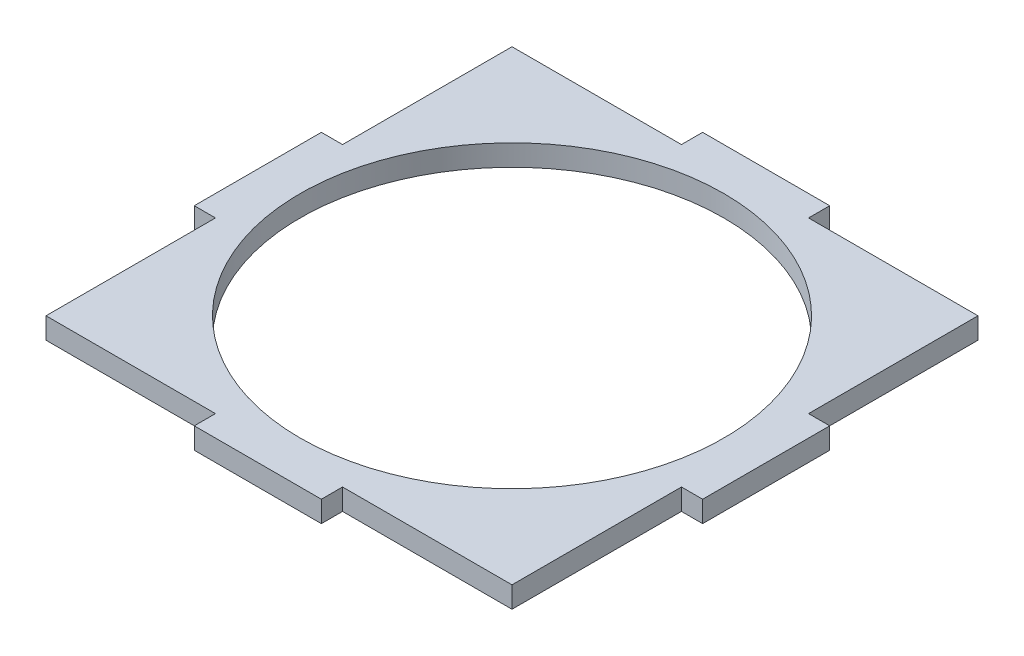
ISO-10303-21;
HEADER;
FILE_DESCRIPTION(('STEP AP214'),'2;1');
FILE_NAME('part.step','',(''),(''),'','','');
FILE_SCHEMA(('AUTOMOTIVE_DESIGN { 1 0 10303 214 1 1 1 1 }'));
ENDSEC;
DATA;
#1=APPLICATION_CONTEXT('core data for automotive mechanical design processes');
#2=APPLICATION_PROTOCOL_DEFINITION('international standard','automotive_design',2000,#1);
#3=PRODUCT_CONTEXT('',#1,'mechanical');
#4=PRODUCT('Part','Part','',(#3));
#5=PRODUCT_RELATED_PRODUCT_CATEGORY('part','',(#4));
#6=PRODUCT_DEFINITION_FORMATION('','',#4);
#7=PRODUCT_DEFINITION_CONTEXT('part definition',#1,'design');
#8=PRODUCT_DEFINITION('design','',#6,#7);
#9=PRODUCT_DEFINITION_SHAPE('','',#8);
#10=(LENGTH_UNIT() NAMED_UNIT(*) SI_UNIT(.MILLI.,.METRE.));
#11=(NAMED_UNIT(*) PLANE_ANGLE_UNIT() SI_UNIT($,.RADIAN.));
#12=(NAMED_UNIT(*) SI_UNIT($,.STERADIAN.) SOLID_ANGLE_UNIT());
#13=UNCERTAINTY_MEASURE_WITH_UNIT(LENGTH_MEASURE(1.E-05),#10,'distance_accuracy_value','');
#14=(GEOMETRIC_REPRESENTATION_CONTEXT(3) GLOBAL_UNCERTAINTY_ASSIGNED_CONTEXT((#13)) GLOBAL_UNIT_ASSIGNED_CONTEXT((#10,
#11,#12)) REPRESENTATION_CONTEXT('',''));
#15=CARTESIAN_POINT('',(0.,0.,0.));
#16=DIRECTION('',(0.,0.,1.));
#17=DIRECTION('',(1.,0.,0.));
#18=AXIS2_PLACEMENT_3D('',#15,#16,#17);
#19=CARTESIAN_POINT('',(-69.85,6.35,-69.85));
#20=DIRECTION('',(0.,0.,-1.));
#21=DIRECTION('',(-1.,0.,0.));
#22=AXIS2_PLACEMENT_3D('',#19,#20,#21);
#23=PLANE('',#22);
#24=DIRECTION('',(1.,0.,0.));
#25=VECTOR('',#24,1.);
#26=CARTESIAN_POINT('',(-69.85,6.35,-69.85));
#27=LINE('',#26,#25);
#28=CARTESIAN_POINT('',(-69.85,6.35,-69.85));
#29=VERTEX_POINT('',#28);
#30=CARTESIAN_POINT('',(-19.0500000000001,6.35,-69.85));
#31=VERTEX_POINT('',#30);
#32=EDGE_CURVE('E204',#29,#31,#27,.T.);
#33=ORIENTED_EDGE('',*,*,#32,.T.);
#34=DIRECTION('',(0.,-1.,0.));
#35=VECTOR('',#34,1.);
#36=CARTESIAN_POINT('',(-19.0500000000001,6.35,-69.85));
#37=LINE('',#36,#35);
#38=CARTESIAN_POINT('',(-19.0500000000001,0.,-69.85));
#39=VERTEX_POINT('',#38);
#40=EDGE_CURVE('E187',#31,#39,#37,.T.);
#41=ORIENTED_EDGE('',*,*,#40,.T.);
#42=DIRECTION('',(1.,0.,0.));
#43=VECTOR('',#42,1.);
#44=CARTESIAN_POINT('',(-69.85,0.,-69.85));
#45=LINE('',#44,#43);
#46=CARTESIAN_POINT('',(-69.85,0.,-69.85));
#47=VERTEX_POINT('',#46);
#48=EDGE_CURVE('E247',#47,#39,#45,.T.);
#49=ORIENTED_EDGE('',*,*,#48,.F.);
#50=DIRECTION('',(0.,-1.,0.));
#51=VECTOR('',#50,1.);
#52=CARTESIAN_POINT('',(-69.85,6.35,-69.85));
#53=LINE('',#52,#51);
#54=EDGE_CURVE('E213',#29,#47,#53,.T.);
#55=ORIENTED_EDGE('',*,*,#54,.F.);
#56=EDGE_LOOP('',(#33,#41,#49,#55));
#57=FACE_BOUND('',#56,.T.);
#58=ADVANCED_FACE('F50',(#57),#23,.T.);
#59=CARTESIAN_POINT('',(69.85,6.35,69.85));
#60=DIRECTION('',(-1.,0.,0.));
#61=DIRECTION('',(0.,0.,1.));
#62=AXIS2_PLACEMENT_3D('',#59,#60,#61);
#63=PLANE('',#62);
#64=DIRECTION('',(0.,-1.,0.));
#65=VECTOR('',#64,1.);
#66=CARTESIAN_POINT('',(69.85,6.35,19.0500000000001));
#67=LINE('',#66,#65);
#68=CARTESIAN_POINT('',(69.85,6.35,19.0500000000001));
#69=VERTEX_POINT('',#68);
#70=CARTESIAN_POINT('',(69.85,0.,19.0500000000001));
#71=VERTEX_POINT('',#70);
#72=EDGE_CURVE('E294',#69,#71,#67,.T.);
#73=ORIENTED_EDGE('',*,*,#72,.F.);
#74=DIRECTION('',(0.,0.,-1.));
#75=VECTOR('',#74,1.);
#76=CARTESIAN_POINT('',(69.85,6.35,69.85));
#77=LINE('',#76,#75);
#78=CARTESIAN_POINT('',(69.85,6.35,69.85));
#79=VERTEX_POINT('',#78);
#80=EDGE_CURVE('E219',#79,#69,#77,.T.);
#81=ORIENTED_EDGE('',*,*,#80,.F.);
#82=DIRECTION('',(0.,-1.,0.));
#83=VECTOR('',#82,1.);
#84=CARTESIAN_POINT('',(69.85,6.35,69.85));
#85=LINE('',#84,#83);
#86=CARTESIAN_POINT('',(69.85,0.,69.85));
#87=VERTEX_POINT('',#86);
#88=EDGE_CURVE('E12',#79,#87,#85,.T.);
#89=ORIENTED_EDGE('',*,*,#88,.T.);
#90=DIRECTION('',(0.,0.,-1.));
#91=VECTOR('',#90,1.);
#92=CARTESIAN_POINT('',(69.85,0.,69.85));
#93=LINE('',#92,#91);
#94=EDGE_CURVE('E271',#87,#71,#93,.T.);
#95=ORIENTED_EDGE('',*,*,#94,.T.);
#96=EDGE_LOOP('',(#73,#81,#89,#95));
#97=FACE_BOUND('',#96,.T.);
#98=ADVANCED_FACE('F407',(#97),#63,.F.);
#99=CARTESIAN_POINT('',(-69.85,6.35,69.85));
#100=DIRECTION('',(0.,0.,-1.));
#101=DIRECTION('',(-1.,0.,0.));
#102=AXIS2_PLACEMENT_3D('',#99,#100,#101);
#103=PLANE('',#102);
#104=DIRECTION('',(0.,-1.,0.));
#105=VECTOR('',#104,1.);
#106=CARTESIAN_POINT('',(-19.05,6.35,69.85));
#107=LINE('',#106,#105);
#108=CARTESIAN_POINT('',(-19.05,6.35,69.85));
#109=VERTEX_POINT('',#108);
#110=CARTESIAN_POINT('',(-19.05,0.,69.85));
#111=VERTEX_POINT('',#110);
#112=EDGE_CURVE('E317',#109,#111,#107,.T.);
#113=ORIENTED_EDGE('',*,*,#112,.F.);
#114=DIRECTION('',(1.,0.,0.));
#115=VECTOR('',#114,1.);
#116=CARTESIAN_POINT('',(-69.85,6.35,69.85));
#117=LINE('',#116,#115);
#118=CARTESIAN_POINT('',(-69.85,6.35,69.85));
#119=VERTEX_POINT('',#118);
#120=EDGE_CURVE('E286',#119,#109,#117,.T.);
#121=ORIENTED_EDGE('',*,*,#120,.F.);
#122=DIRECTION('',(0.,-1.,0.));
#123=VECTOR('',#122,1.);
#124=CARTESIAN_POINT('',(-69.85,6.35,69.85));
#125=LINE('',#124,#123);
#126=CARTESIAN_POINT('',(-69.85,0.,69.85));
#127=VERTEX_POINT('',#126);
#128=EDGE_CURVE('E242',#119,#127,#125,.T.);
#129=ORIENTED_EDGE('',*,*,#128,.T.);
#130=DIRECTION('',(1.,0.,0.));
#131=VECTOR('',#130,1.);
#132=CARTESIAN_POINT('',(-69.85,0.,69.85));
#133=LINE('',#132,#131);
#134=EDGE_CURVE('E272',#127,#111,#133,.T.);
#135=ORIENTED_EDGE('',*,*,#134,.T.);
#136=EDGE_LOOP('',(#113,#121,#129,#135));
#137=FACE_BOUND('',#136,.T.);
#138=ADVANCED_FACE('F343',(#137),#103,.F.);
#139=CARTESIAN_POINT('',(-69.85,6.35,69.85));
#140=DIRECTION('',(-1.,0.,0.));
#141=DIRECTION('',(0.,0.,1.));
#142=AXIS2_PLACEMENT_3D('',#139,#140,#141);
#143=PLANE('',#142);
#144=DIRECTION('',(0.,0.,-1.));
#145=VECTOR('',#144,1.);
#146=CARTESIAN_POINT('',(-69.85,6.35,69.85));
#147=LINE('',#146,#145);
#148=CARTESIAN_POINT('',(-69.85,6.35,19.05));
#149=VERTEX_POINT('',#148);
#150=EDGE_CURVE('E217',#119,#149,#147,.T.);
#151=ORIENTED_EDGE('',*,*,#150,.T.);
#152=DIRECTION('',(0.,-1.,0.));
#153=VECTOR('',#152,1.);
#154=CARTESIAN_POINT('',(-69.85,6.35,19.05));
#155=LINE('',#154,#153);
#156=CARTESIAN_POINT('',(-69.85,0.,19.05));
#157=VERTEX_POINT('',#156);
#158=EDGE_CURVE('E349',#149,#157,#155,.T.);
#159=ORIENTED_EDGE('',*,*,#158,.T.);
#160=DIRECTION('',(0.,0.,-1.));
#161=VECTOR('',#160,1.);
#162=CARTESIAN_POINT('',(-69.85,0.,69.85));
#163=LINE('',#162,#161);
#164=EDGE_CURVE('E246',#127,#157,#163,.T.);
#165=ORIENTED_EDGE('',*,*,#164,.F.);
#166=ORIENTED_EDGE('',*,*,#128,.F.);
#167=EDGE_LOOP('',(#151,#159,#165,#166));
#168=FACE_BOUND('',#167,.T.);
#169=ADVANCED_FACE('F347',(#168),#143,.T.);
#170=CARTESIAN_POINT('',(0.,6.35,0.));
#171=DIRECTION('',(0.,1.,0.));
#172=DIRECTION('',(0.,0.,1.));
#173=AXIS2_PLACEMENT_3D('',#170,#171,#172);
#174=PLANE('',#173);
#175=ORIENTED_EDGE('',*,*,#120,.T.);
#176=DIRECTION('',(0.,0.,1.));
#177=VECTOR('',#176,1.);
#178=CARTESIAN_POINT('',(-19.0500000000001,6.35,0.));
#179=LINE('',#178,#177);
#180=CARTESIAN_POINT('',(-19.05,6.35,76.2));
#181=VERTEX_POINT('',#180);
#182=EDGE_CURVE('E307',#109,#181,#179,.T.);
#183=ORIENTED_EDGE('',*,*,#182,.T.);
#184=DIRECTION('',(1.,0.,0.));
#185=VECTOR('',#184,1.);
#186=CARTESIAN_POINT('',(0.,6.35,76.2));
#187=LINE('',#186,#185);
#188=CARTESIAN_POINT('',(19.05,6.35,76.2));
#189=VERTEX_POINT('',#188);
#190=EDGE_CURVE('E304',#181,#189,#187,.T.);
#191=ORIENTED_EDGE('',*,*,#190,.T.);
#192=DIRECTION('',(0.,0.,1.));
#193=VECTOR('',#192,1.);
#194=CARTESIAN_POINT('',(19.05,6.35,0.));
#195=LINE('',#194,#193);
#196=CARTESIAN_POINT('',(19.05,6.35,69.85));
#197=VERTEX_POINT('',#196);
#198=EDGE_CURVE('E306',#197,#189,#195,.T.);
#199=ORIENTED_EDGE('',*,*,#198,.F.);
#200=EDGE_CURVE('E351',#197,#79,#117,.T.);
#201=ORIENTED_EDGE('',*,*,#200,.T.);
#202=ORIENTED_EDGE('',*,*,#80,.T.);
#203=DIRECTION('',(1.,0.,0.));
#204=VECTOR('',#203,1.);
#205=CARTESIAN_POINT('',(0.,6.35,19.05));
#206=LINE('',#205,#204);
#207=CARTESIAN_POINT('',(76.2,6.35,19.0500000000001));
#208=VERTEX_POINT('',#207);
#209=EDGE_CURVE('E409',#69,#208,#206,.T.);
#210=ORIENTED_EDGE('',*,*,#209,.T.);
#211=DIRECTION('',(0.,0.,1.));
#212=VECTOR('',#211,1.);
#213=CARTESIAN_POINT('',(76.2,6.35,0.));
#214=LINE('',#213,#212);
#215=CARTESIAN_POINT('',(76.2,6.35,-19.0499999999999));
#216=VERTEX_POINT('',#215);
#217=EDGE_CURVE('E413',#216,#208,#214,.T.);
#218=ORIENTED_EDGE('',*,*,#217,.F.);
#219=DIRECTION('',(1.,0.,0.));
#220=VECTOR('',#219,1.);
#221=CARTESIAN_POINT('',(0.,6.35,-19.0499999999999));
#222=LINE('',#221,#220);
#223=CARTESIAN_POINT('',(69.85,6.35,-19.0499999999999));
#224=VERTEX_POINT('',#223);
#225=EDGE_CURVE('E295',#224,#216,#222,.T.);
#226=ORIENTED_EDGE('',*,*,#225,.F.);
#227=CARTESIAN_POINT('',(69.85,6.35,-69.85));
#228=VERTEX_POINT('',#227);
#229=EDGE_CURVE('E266',#224,#228,#77,.T.);
#230=ORIENTED_EDGE('',*,*,#229,.T.);
#231=CARTESIAN_POINT('',(19.05,6.35,-69.85));
#232=VERTEX_POINT('',#231);
#233=EDGE_CURVE('E215',#232,#228,#27,.T.);
#234=ORIENTED_EDGE('',*,*,#233,.F.);
#235=DIRECTION('',(0.,0.,-1.));
#236=VECTOR('',#235,1.);
#237=CARTESIAN_POINT('',(19.05,6.35,0.));
#238=LINE('',#237,#236);
#239=CARTESIAN_POINT('',(19.05,6.35,-76.2));
#240=VERTEX_POINT('',#239);
#241=EDGE_CURVE('E208',#232,#240,#238,.T.);
#242=ORIENTED_EDGE('',*,*,#241,.T.);
#243=DIRECTION('',(-1.,0.,0.));
#244=VECTOR('',#243,1.);
#245=CARTESIAN_POINT('',(0.,6.35,-76.2));
#246=LINE('',#245,#244);
#247=CARTESIAN_POINT('',(-19.0500000000001,6.35,-76.2));
#248=VERTEX_POINT('',#247);
#249=EDGE_CURVE('E206',#240,#248,#246,.T.);
#250=ORIENTED_EDGE('',*,*,#249,.T.);
#251=DIRECTION('',(0.,0.,-1.));
#252=VECTOR('',#251,1.);
#253=CARTESIAN_POINT('',(-19.0500000000001,6.35,0.));
#254=LINE('',#253,#252);
#255=EDGE_CURVE('E190',#31,#248,#254,.T.);
#256=ORIENTED_EDGE('',*,*,#255,.F.);
#257=ORIENTED_EDGE('',*,*,#32,.F.);
#258=CARTESIAN_POINT('',(-69.85,6.35,-19.05));
#259=VERTEX_POINT('',#258);
#260=EDGE_CURVE('E214',#259,#29,#147,.T.);
#261=ORIENTED_EDGE('',*,*,#260,.F.);
#262=DIRECTION('',(-1.,0.,0.));
#263=VECTOR('',#262,1.);
#264=CARTESIAN_POINT('',(0.,6.35,-19.05));
#265=LINE('',#264,#263);
#266=CARTESIAN_POINT('',(-76.2,6.35,-19.05));
#267=VERTEX_POINT('',#266);
#268=EDGE_CURVE('E383',#259,#267,#265,.T.);
#269=ORIENTED_EDGE('',*,*,#268,.T.);
#270=DIRECTION('',(0.,0.,-1.));
#271=VECTOR('',#270,1.);
#272=CARTESIAN_POINT('',(-76.2,6.35,0.));
#273=LINE('',#272,#271);
#274=CARTESIAN_POINT('',(-76.2,6.35,19.05));
#275=VERTEX_POINT('',#274);
#276=EDGE_CURVE('E384',#275,#267,#273,.T.);
#277=ORIENTED_EDGE('',*,*,#276,.F.);
#278=DIRECTION('',(-1.,0.,0.));
#279=VECTOR('',#278,1.);
#280=CARTESIAN_POINT('',(0.,6.35,19.05));
#281=LINE('',#280,#279);
#282=EDGE_CURVE('E380',#149,#275,#281,.T.);
#283=ORIENTED_EDGE('',*,*,#282,.F.);
#284=ORIENTED_EDGE('',*,*,#150,.F.);
#285=EDGE_LOOP('',(#175,#183,#191,#199,#201,#202,#210,#218,#226,#230,#234,#242,#250,#256,#257,
#261,#269,#277,#283,#284));
#286=FACE_BOUND('',#285,.T.);
#287=CARTESIAN_POINT('',(0.,6.35,0.));
#288=DIRECTION('',(0.,1.,0.));
#289=DIRECTION('',(0.,0.,1.));
#290=AXIS2_PLACEMENT_3D('',#287,#288,#289);
#291=CIRCLE('',#290,63.5);
#292=CARTESIAN_POINT('',(0.,6.35,63.5));
#293=VERTEX_POINT('',#292);
#294=EDGE_CURVE('E366',#293,#293,#291,.T.);
#295=ORIENTED_EDGE('',*,*,#294,.F.);
#296=EDGE_LOOP('',(#295));
#297=FACE_BOUND('',#296,.T.);
#298=ADVANCED_FACE('F201',(#286,#297),#174,.T.);
#299=CARTESIAN_POINT('',(0.,0.,0.));
#300=DIRECTION('',(0.,1.,0.));
#301=DIRECTION('',(0.,0.,1.));
#302=AXIS2_PLACEMENT_3D('',#299,#300,#301);
#303=PLANE('',#302);
#304=ORIENTED_EDGE('',*,*,#134,.F.);
#305=ORIENTED_EDGE('',*,*,#164,.T.);
#306=DIRECTION('',(-1.,0.,0.));
#307=VECTOR('',#306,1.);
#308=CARTESIAN_POINT('',(0.,0.,19.05));
#309=LINE('',#308,#307);
#310=CARTESIAN_POINT('',(-76.2,0.,19.05));
#311=VERTEX_POINT('',#310);
#312=EDGE_CURVE('E395',#157,#311,#309,.T.);
#313=ORIENTED_EDGE('',*,*,#312,.T.);
#314=DIRECTION('',(0.,0.,-1.));
#315=VECTOR('',#314,1.);
#316=CARTESIAN_POINT('',(-76.2,0.,0.));
#317=LINE('',#316,#315);
#318=CARTESIAN_POINT('',(-76.2,0.,-19.05));
#319=VERTEX_POINT('',#318);
#320=EDGE_CURVE('E471',#311,#319,#317,.T.);
#321=ORIENTED_EDGE('',*,*,#320,.T.);
#322=DIRECTION('',(-1.,0.,0.));
#323=VECTOR('',#322,1.);
#324=CARTESIAN_POINT('',(0.,0.,-19.05));
#325=LINE('',#324,#323);
#326=CARTESIAN_POINT('',(-69.85,0.,-19.05));
#327=VERTEX_POINT('',#326);
#328=EDGE_CURVE('E392',#327,#319,#325,.T.);
#329=ORIENTED_EDGE('',*,*,#328,.F.);
#330=EDGE_CURVE('E243',#327,#47,#163,.T.);
#331=ORIENTED_EDGE('',*,*,#330,.T.);
#332=ORIENTED_EDGE('',*,*,#48,.T.);
#333=DIRECTION('',(0.,0.,-1.));
#334=VECTOR('',#333,1.);
#335=CARTESIAN_POINT('',(-19.0500000000001,0.,0.));
#336=LINE('',#335,#334);
#337=CARTESIAN_POINT('',(-19.0500000000001,0.,-76.2));
#338=VERTEX_POINT('',#337);
#339=EDGE_CURVE('E67',#39,#338,#336,.T.);
#340=ORIENTED_EDGE('',*,*,#339,.T.);
#341=DIRECTION('',(-1.,0.,0.));
#342=VECTOR('',#341,1.);
#343=CARTESIAN_POINT('',(0.,0.,-76.2));
#344=LINE('',#343,#342);
#345=CARTESIAN_POINT('',(19.05,0.,-76.2));
#346=VERTEX_POINT('',#345);
#347=EDGE_CURVE('E209',#346,#338,#344,.T.);
#348=ORIENTED_EDGE('',*,*,#347,.F.);
#349=DIRECTION('',(0.,0.,-1.));
#350=VECTOR('',#349,1.);
#351=CARTESIAN_POINT('',(19.05,0.,0.));
#352=LINE('',#351,#350);
#353=CARTESIAN_POINT('',(19.05,0.,-69.85));
#354=VERTEX_POINT('',#353);
#355=EDGE_CURVE('E439',#354,#346,#352,.T.);
#356=ORIENTED_EDGE('',*,*,#355,.F.);
#357=CARTESIAN_POINT('',(69.85,0.,-69.85));
#358=VERTEX_POINT('',#357);
#359=EDGE_CURVE('E223',#354,#358,#45,.T.);
#360=ORIENTED_EDGE('',*,*,#359,.T.);
#361=CARTESIAN_POINT('',(69.85,0.,-19.0499999999999));
#362=VERTEX_POINT('',#361);
#363=EDGE_CURVE('E268',#362,#358,#93,.T.);
#364=ORIENTED_EDGE('',*,*,#363,.F.);
#365=DIRECTION('',(1.,0.,0.));
#366=VECTOR('',#365,1.);
#367=CARTESIAN_POINT('',(0.,0.,-19.0499999999999));
#368=LINE('',#367,#366);
#369=CARTESIAN_POINT('',(76.2,0.,-19.0499999999999));
#370=VERTEX_POINT('',#369);
#371=EDGE_CURVE('E75',#362,#370,#368,.T.);
#372=ORIENTED_EDGE('',*,*,#371,.T.);
#373=DIRECTION('',(0.,0.,1.));
#374=VECTOR('',#373,1.);
#375=CARTESIAN_POINT('',(76.2,0.,0.));
#376=LINE('',#375,#374);
#377=CARTESIAN_POINT('',(76.2,0.,19.0500000000001));
#378=VERTEX_POINT('',#377);
#379=EDGE_CURVE('E195',#370,#378,#376,.T.);
#380=ORIENTED_EDGE('',*,*,#379,.T.);
#381=DIRECTION('',(1.,0.,0.));
#382=VECTOR('',#381,1.);
#383=CARTESIAN_POINT('',(0.,0.,19.05));
#384=LINE('',#383,#382);
#385=EDGE_CURVE('E288',#71,#378,#384,.T.);
#386=ORIENTED_EDGE('',*,*,#385,.F.);
#387=ORIENTED_EDGE('',*,*,#94,.F.);
#388=CARTESIAN_POINT('',(19.05,0.,69.85));
#389=VERTEX_POINT('',#388);
#390=EDGE_CURVE('E277',#389,#87,#133,.T.);
#391=ORIENTED_EDGE('',*,*,#390,.F.);
#392=DIRECTION('',(0.,0.,1.));
#393=VECTOR('',#392,1.);
#394=CARTESIAN_POINT('',(19.05,0.,0.));
#395=LINE('',#394,#393);
#396=CARTESIAN_POINT('',(19.05,0.,76.2));
#397=VERTEX_POINT('',#396);
#398=EDGE_CURVE('E311',#389,#397,#395,.T.);
#399=ORIENTED_EDGE('',*,*,#398,.T.);
#400=DIRECTION('',(1.,0.,0.));
#401=VECTOR('',#400,1.);
#402=CARTESIAN_POINT('',(0.,0.,76.2));
#403=LINE('',#402,#401);
#404=CARTESIAN_POINT('',(-19.05,0.,76.2));
#405=VERTEX_POINT('',#404);
#406=EDGE_CURVE('E308',#405,#397,#403,.T.);
#407=ORIENTED_EDGE('',*,*,#406,.F.);
#408=DIRECTION('',(0.,0.,1.));
#409=VECTOR('',#408,1.);
#410=CARTESIAN_POINT('',(-19.0500000000001,0.,0.));
#411=LINE('',#410,#409);
#412=EDGE_CURVE('E303',#111,#405,#411,.T.);
#413=ORIENTED_EDGE('',*,*,#412,.F.);
#414=EDGE_LOOP('',(#304,#305,#313,#321,#329,#331,#332,#340,#348,#356,#360,#364,#372,#380,#386,
#387,#391,#399,#407,#413));
#415=FACE_BOUND('',#414,.T.);
#416=CARTESIAN_POINT('',(0.,0.,0.));
#417=DIRECTION('',(0.,1.,0.));
#418=DIRECTION('',(0.,0.,1.));
#419=AXIS2_PLACEMENT_3D('',#416,#417,#418);
#420=CIRCLE('',#419,63.5);
#421=CARTESIAN_POINT('',(0.,0.,63.5));
#422=VERTEX_POINT('',#421);
#423=EDGE_CURVE('E362',#422,#422,#420,.T.);
#424=ORIENTED_EDGE('',*,*,#423,.T.);
#425=EDGE_LOOP('',(#424));
#426=FACE_BOUND('',#425,.T.);
#427=ADVANCED_FACE('F337',(#415,#426),#303,.F.);
#428=ORIENTED_EDGE('',*,*,#200,.F.);
#429=DIRECTION('',(0.,-1.,0.));
#430=VECTOR('',#429,1.);
#431=CARTESIAN_POINT('',(19.05,6.35,69.85));
#432=LINE('',#431,#430);
#433=EDGE_CURVE('E320',#197,#389,#432,.T.);
#434=ORIENTED_EDGE('',*,*,#433,.T.);
#435=ORIENTED_EDGE('',*,*,#390,.T.);
#436=ORIENTED_EDGE('',*,*,#88,.F.);
#437=EDGE_LOOP('',(#428,#434,#435,#436));
#438=FACE_BOUND('',#437,.T.);
#439=ADVANCED_FACE('F52',(#438),#103,.F.);
#440=ORIENTED_EDGE('',*,*,#229,.F.);
#441=DIRECTION('',(0.,-1.,0.));
#442=VECTOR('',#441,1.);
#443=CARTESIAN_POINT('',(69.85,6.35,-19.0499999999999));
#444=LINE('',#443,#442);
#445=EDGE_CURVE('E269',#224,#362,#444,.T.);
#446=ORIENTED_EDGE('',*,*,#445,.T.);
#447=ORIENTED_EDGE('',*,*,#363,.T.);
#448=DIRECTION('',(0.,-1.,0.));
#449=VECTOR('',#448,1.);
#450=CARTESIAN_POINT('',(69.85,6.35,-69.85));
#451=LINE('',#450,#449);
#452=EDGE_CURVE('E59',#228,#358,#451,.T.);
#453=ORIENTED_EDGE('',*,*,#452,.F.);
#454=EDGE_LOOP('',(#440,#446,#447,#453));
#455=FACE_BOUND('',#454,.T.);
#456=ADVANCED_FACE('F265',(#455),#63,.F.);
#457=DIRECTION('',(0.,-1.,0.));
#458=VECTOR('',#457,1.);
#459=CARTESIAN_POINT('',(19.05,6.35,-69.85));
#460=LINE('',#459,#458);
#461=EDGE_CURVE('E196',#232,#354,#460,.T.);
#462=ORIENTED_EDGE('',*,*,#461,.F.);
#463=ORIENTED_EDGE('',*,*,#233,.T.);
#464=ORIENTED_EDGE('',*,*,#452,.T.);
#465=ORIENTED_EDGE('',*,*,#359,.F.);
#466=EDGE_LOOP('',(#462,#463,#464,#465));
#467=FACE_BOUND('',#466,.T.);
#468=ADVANCED_FACE('F259',(#467),#23,.T.);
#469=DIRECTION('',(0.,-1.,0.));
#470=VECTOR('',#469,1.);
#471=CARTESIAN_POINT('',(-69.85,6.35,-19.05));
#472=LINE('',#471,#470);
#473=EDGE_CURVE('E378',#259,#327,#472,.T.);
#474=ORIENTED_EDGE('',*,*,#473,.F.);
#475=ORIENTED_EDGE('',*,*,#260,.T.);
#476=ORIENTED_EDGE('',*,*,#54,.T.);
#477=ORIENTED_EDGE('',*,*,#330,.F.);
#478=EDGE_LOOP('',(#474,#475,#476,#477));
#479=FACE_BOUND('',#478,.T.);
#480=ADVANCED_FACE('F458',(#479),#143,.T.);
#481=CARTESIAN_POINT('',(0.,6.35,0.));
#482=DIRECTION('',(0.,-1.,0.));
#483=DIRECTION('',(0.,0.,-1.));
#484=AXIS2_PLACEMENT_3D('',#481,#482,#483);
#485=CYLINDRICAL_SURFACE('',#484,63.5);
#486=ORIENTED_EDGE('',*,*,#294,.T.);
#487=EDGE_LOOP('',(#486));
#488=FACE_BOUND('',#487,.T.);
#489=ORIENTED_EDGE('',*,*,#423,.F.);
#490=EDGE_LOOP('',(#489));
#491=FACE_BOUND('',#490,.T.);
#492=ADVANCED_FACE('F500',(#488,#491),#485,.F.);
#493=CARTESIAN_POINT('',(-76.2,6.35,0.));
#494=DIRECTION('',(-1.,0.,0.));
#495=DIRECTION('',(0.,0.,1.));
#496=AXIS2_PLACEMENT_3D('',#493,#494,#495);
#497=PLANE('',#496);
#498=ORIENTED_EDGE('',*,*,#320,.F.);
#499=DIRECTION('',(0.,-1.,0.));
#500=VECTOR('',#499,1.);
#501=CARTESIAN_POINT('',(-76.2,6.35,19.05));
#502=LINE('',#501,#500);
#503=EDGE_CURVE('E367',#275,#311,#502,.T.);
#504=ORIENTED_EDGE('',*,*,#503,.F.);
#505=ORIENTED_EDGE('',*,*,#276,.T.);
#506=DIRECTION('',(0.,-1.,0.));
#507=VECTOR('',#506,1.);
#508=CARTESIAN_POINT('',(-76.2,6.35,-19.05));
#509=LINE('',#508,#507);
#510=EDGE_CURVE('E388',#267,#319,#509,.T.);
#511=ORIENTED_EDGE('',*,*,#510,.T.);
#512=EDGE_LOOP('',(#498,#504,#505,#511));
#513=FACE_BOUND('',#512,.T.);
#514=ADVANCED_FACE('F467',(#513),#497,.T.);
#515=CARTESIAN_POINT('',(0.,6.35,19.05));
#516=DIRECTION('',(0.,0.,1.));
#517=DIRECTION('',(1.,0.,0.));
#518=AXIS2_PLACEMENT_3D('',#515,#516,#517);
#519=PLANE('',#518);
#520=ORIENTED_EDGE('',*,*,#312,.F.);
#521=ORIENTED_EDGE('',*,*,#158,.F.);
#522=ORIENTED_EDGE('',*,*,#282,.T.);
#523=ORIENTED_EDGE('',*,*,#503,.T.);
#524=EDGE_LOOP('',(#520,#521,#522,#523));
#525=FACE_BOUND('',#524,.T.);
#526=ADVANCED_FACE('F522',(#525),#519,.T.);
#527=CARTESIAN_POINT('',(0.,6.35,-19.05));
#528=DIRECTION('',(0.,0.,1.));
#529=DIRECTION('',(1.,0.,0.));
#530=AXIS2_PLACEMENT_3D('',#527,#528,#529);
#531=PLANE('',#530);
#532=ORIENTED_EDGE('',*,*,#328,.T.);
#533=ORIENTED_EDGE('',*,*,#510,.F.);
#534=ORIENTED_EDGE('',*,*,#268,.F.);
#535=ORIENTED_EDGE('',*,*,#473,.T.);
#536=EDGE_LOOP('',(#532,#533,#534,#535));
#537=FACE_BOUND('',#536,.T.);
#538=ADVANCED_FACE('F464',(#537),#531,.F.);
#539=CARTESIAN_POINT('',(-19.0500000000001,6.35,0.));
#540=DIRECTION('',(1.,0.,0.));
#541=DIRECTION('',(0.,0.,-1.));
#542=AXIS2_PLACEMENT_3D('',#539,#540,#541);
#543=PLANE('',#542);
#544=ORIENTED_EDGE('',*,*,#412,.T.);
#545=DIRECTION('',(0.,-1.,0.));
#546=VECTOR('',#545,1.);
#547=CARTESIAN_POINT('',(-19.05,6.35,76.2));
#548=LINE('',#547,#546);
#549=EDGE_CURVE('E334',#181,#405,#548,.T.);
#550=ORIENTED_EDGE('',*,*,#549,.F.);
#551=ORIENTED_EDGE('',*,*,#182,.F.);
#552=ORIENTED_EDGE('',*,*,#112,.T.);
#553=EDGE_LOOP('',(#544,#550,#551,#552));
#554=FACE_BOUND('',#553,.T.);
#555=ADVANCED_FACE('F332',(#554),#543,.F.);
#556=CARTESIAN_POINT('',(0.,6.35,76.2));
#557=DIRECTION('',(0.,0.,-1.));
#558=DIRECTION('',(-1.,0.,0.));
#559=AXIS2_PLACEMENT_3D('',#556,#557,#558);
#560=PLANE('',#559);
#561=ORIENTED_EDGE('',*,*,#406,.T.);
#562=DIRECTION('',(0.,-1.,0.));
#563=VECTOR('',#562,1.);
#564=CARTESIAN_POINT('',(19.05,6.35,76.2));
#565=LINE('',#564,#563);
#566=EDGE_CURVE('E472',#189,#397,#565,.T.);
#567=ORIENTED_EDGE('',*,*,#566,.F.);
#568=ORIENTED_EDGE('',*,*,#190,.F.);
#569=ORIENTED_EDGE('',*,*,#549,.T.);
#570=EDGE_LOOP('',(#561,#567,#568,#569));
#571=FACE_BOUND('',#570,.T.);
#572=ADVANCED_FACE('F480',(#571),#560,.F.);
#573=CARTESIAN_POINT('',(19.05,6.35,0.));
#574=DIRECTION('',(1.,0.,0.));
#575=DIRECTION('',(0.,0.,-1.));
#576=AXIS2_PLACEMENT_3D('',#573,#574,#575);
#577=PLANE('',#576);
#578=ORIENTED_EDGE('',*,*,#398,.F.);
#579=ORIENTED_EDGE('',*,*,#433,.F.);
#580=ORIENTED_EDGE('',*,*,#198,.T.);
#581=ORIENTED_EDGE('',*,*,#566,.T.);
#582=EDGE_LOOP('',(#578,#579,#580,#581));
#583=FACE_BOUND('',#582,.T.);
#584=ADVANCED_FACE('F479',(#583),#577,.T.);
#585=CARTESIAN_POINT('',(76.2,6.35,0.));
#586=DIRECTION('',(1.,0.,0.));
#587=DIRECTION('',(0.,0.,-1.));
#588=AXIS2_PLACEMENT_3D('',#585,#586,#587);
#589=PLANE('',#588);
#590=ORIENTED_EDGE('',*,*,#379,.F.);
#591=DIRECTION('',(0.,-1.,0.));
#592=VECTOR('',#591,1.);
#593=CARTESIAN_POINT('',(76.2,6.35,-19.0499999999999));
#594=LINE('',#593,#592);
#595=EDGE_CURVE('E293',#216,#370,#594,.T.);
#596=ORIENTED_EDGE('',*,*,#595,.F.);
#597=ORIENTED_EDGE('',*,*,#217,.T.);
#598=DIRECTION('',(0.,-1.,0.));
#599=VECTOR('',#598,1.);
#600=CARTESIAN_POINT('',(76.2,6.35,19.0500000000001));
#601=LINE('',#600,#599);
#602=EDGE_CURVE('E416',#208,#378,#601,.T.);
#603=ORIENTED_EDGE('',*,*,#602,.T.);
#604=EDGE_LOOP('',(#590,#596,#597,#603));
#605=FACE_BOUND('',#604,.T.);
#606=ADVANCED_FACE('F421',(#605),#589,.T.);
#607=CARTESIAN_POINT('',(0.,6.35,-19.0499999999999));
#608=DIRECTION('',(0.,0.,-1.));
#609=DIRECTION('',(-1.,0.,0.));
#610=AXIS2_PLACEMENT_3D('',#607,#608,#609);
#611=PLANE('',#610);
#612=ORIENTED_EDGE('',*,*,#371,.F.);
#613=ORIENTED_EDGE('',*,*,#445,.F.);
#614=ORIENTED_EDGE('',*,*,#225,.T.);
#615=ORIENTED_EDGE('',*,*,#595,.T.);
#616=EDGE_LOOP('',(#612,#613,#614,#615));
#617=FACE_BOUND('',#616,.T.);
#618=ADVANCED_FACE('F554',(#617),#611,.T.);
#619=CARTESIAN_POINT('',(0.,6.35,19.05));
#620=DIRECTION('',(0.,0.,-1.));
#621=DIRECTION('',(-1.,0.,0.));
#622=AXIS2_PLACEMENT_3D('',#619,#620,#621);
#623=PLANE('',#622);
#624=ORIENTED_EDGE('',*,*,#385,.T.);
#625=ORIENTED_EDGE('',*,*,#602,.F.);
#626=ORIENTED_EDGE('',*,*,#209,.F.);
#627=ORIENTED_EDGE('',*,*,#72,.T.);
#628=EDGE_LOOP('',(#624,#625,#626,#627));
#629=FACE_BOUND('',#628,.T.);
#630=ADVANCED_FACE('F418',(#629),#623,.F.);
#631=CARTESIAN_POINT('',(-19.0500000000001,6.35,0.));
#632=DIRECTION('',(-1.,0.,0.));
#633=DIRECTION('',(0.,0.,1.));
#634=AXIS2_PLACEMENT_3D('',#631,#632,#633);
#635=PLANE('',#634);
#636=ORIENTED_EDGE('',*,*,#339,.F.);
#637=ORIENTED_EDGE('',*,*,#40,.F.);
#638=ORIENTED_EDGE('',*,*,#255,.T.);
#639=DIRECTION('',(0.,-1.,0.));
#640=VECTOR('',#639,1.);
#641=CARTESIAN_POINT('',(-19.0500000000001,6.35,-76.2));
#642=LINE('',#641,#640);
#643=EDGE_CURVE('E601',#248,#338,#642,.T.);
#644=ORIENTED_EDGE('',*,*,#643,.T.);
#645=EDGE_LOOP('',(#636,#637,#638,#644));
#646=FACE_BOUND('',#645,.T.);
#647=ADVANCED_FACE('F189',(#646),#635,.T.);
#648=CARTESIAN_POINT('',(19.05,6.35,0.));
#649=DIRECTION('',(-1.,0.,0.));
#650=DIRECTION('',(0.,0.,1.));
#651=AXIS2_PLACEMENT_3D('',#648,#649,#650);
#652=PLANE('',#651);
#653=ORIENTED_EDGE('',*,*,#355,.T.);
#654=DIRECTION('',(0.,-1.,0.));
#655=VECTOR('',#654,1.);
#656=CARTESIAN_POINT('',(19.05,6.35,-76.2));
#657=LINE('',#656,#655);
#658=EDGE_CURVE('E436',#240,#346,#657,.T.);
#659=ORIENTED_EDGE('',*,*,#658,.F.);
#660=ORIENTED_EDGE('',*,*,#241,.F.);
#661=ORIENTED_EDGE('',*,*,#461,.T.);
#662=EDGE_LOOP('',(#653,#659,#660,#661));
#663=FACE_BOUND('',#662,.T.);
#664=ADVANCED_FACE('F579',(#663),#652,.F.);
#665=CARTESIAN_POINT('',(0.,6.35,-76.2));
#666=DIRECTION('',(0.,0.,1.));
#667=DIRECTION('',(1.,0.,0.));
#668=AXIS2_PLACEMENT_3D('',#665,#666,#667);
#669=PLANE('',#668);
#670=ORIENTED_EDGE('',*,*,#347,.T.);
#671=ORIENTED_EDGE('',*,*,#643,.F.);
#672=ORIENTED_EDGE('',*,*,#249,.F.);
#673=ORIENTED_EDGE('',*,*,#658,.T.);
#674=EDGE_LOOP('',(#670,#671,#672,#673));
#675=FACE_BOUND('',#674,.T.);
#676=ADVANCED_FACE('F588',(#675),#669,.F.);
#677=CLOSED_SHELL('',(#58,#98,#138,#169,#298,#427,#439,#456,#468,#480,#492,#514,#526,#538,#555,
#572,#584,#606,#618,#630,#647,#664,#676));
#678=MANIFOLD_SOLID_BREP('B2',#677);
#679=ADVANCED_BREP_SHAPE_REPRESENTATION('',(#18,#678),#14);
#680=SHAPE_DEFINITION_REPRESENTATION(#9,#679);
ENDSEC;
END-ISO-10303-21;
